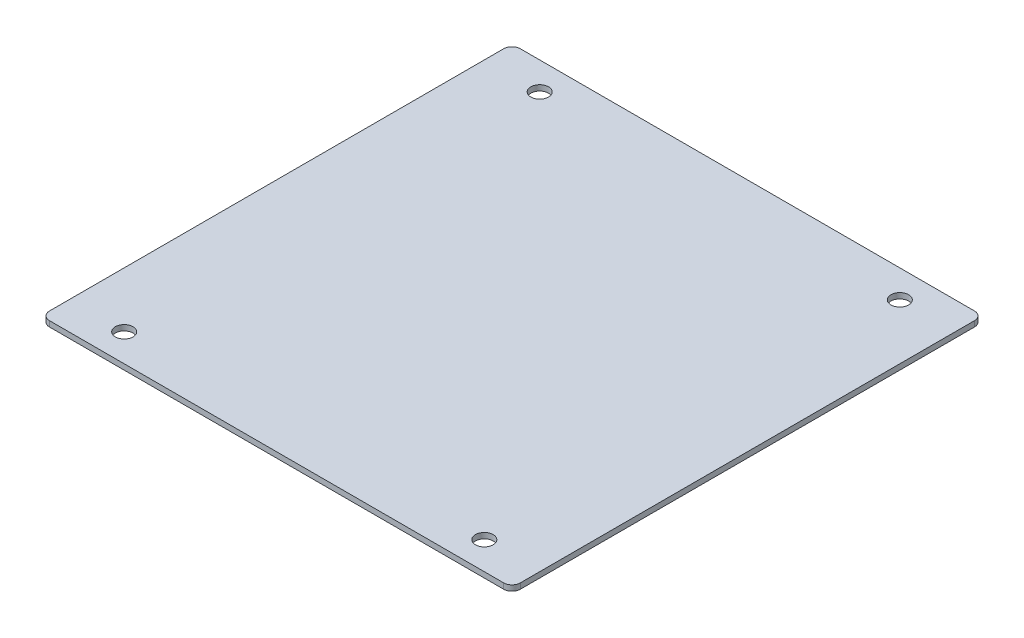
ISO-10303-21;
HEADER;
FILE_DESCRIPTION(('STEP AP214'),'2;1');
FILE_NAME('part.step','',(''),(''),'','','');
FILE_SCHEMA(('AUTOMOTIVE_DESIGN { 1 0 10303 214 1 1 1 1 }'));
ENDSEC;
DATA;
#1=APPLICATION_CONTEXT('core data for automotive mechanical design processes');
#2=APPLICATION_PROTOCOL_DEFINITION('international standard','automotive_design',2000,#1);
#3=PRODUCT_CONTEXT('',#1,'mechanical');
#4=PRODUCT('Part','Part','',(#3));
#5=PRODUCT_RELATED_PRODUCT_CATEGORY('part','',(#4));
#6=PRODUCT_DEFINITION_FORMATION('','',#4);
#7=PRODUCT_DEFINITION_CONTEXT('part definition',#1,'design');
#8=PRODUCT_DEFINITION('design','',#6,#7);
#9=PRODUCT_DEFINITION_SHAPE('','',#8);
#10=(LENGTH_UNIT() NAMED_UNIT(*) SI_UNIT(.MILLI.,.METRE.));
#11=(NAMED_UNIT(*) PLANE_ANGLE_UNIT() SI_UNIT($,.RADIAN.));
#12=(NAMED_UNIT(*) SI_UNIT($,.STERADIAN.) SOLID_ANGLE_UNIT());
#13=UNCERTAINTY_MEASURE_WITH_UNIT(LENGTH_MEASURE(1.E-05),#10,'distance_accuracy_value','');
#14=(GEOMETRIC_REPRESENTATION_CONTEXT(3) GLOBAL_UNCERTAINTY_ASSIGNED_CONTEXT((#13)) GLOBAL_UNIT_ASSIGNED_CONTEXT((#10,
#11,#12)) REPRESENTATION_CONTEXT('',''));
#15=CARTESIAN_POINT('',(0.,0.,0.));
#16=DIRECTION('',(0.,0.,1.));
#17=DIRECTION('',(1.,0.,0.));
#18=AXIS2_PLACEMENT_3D('',#15,#16,#17);
#19=CARTESIAN_POINT('',(85.,2.,85.));
#20=DIRECTION('',(-1.,0.,0.));
#21=DIRECTION('',(0.,0.,1.));
#22=AXIS2_PLACEMENT_3D('',#19,#20,#21);
#23=PLANE('',#22);
#24=DIRECTION('',(0.,0.,-1.));
#25=VECTOR('',#24,1.);
#26=CARTESIAN_POINT('',(85.,0.,85.));
#27=LINE('',#26,#25);
#28=CARTESIAN_POINT('',(85.,0.,82.));
#29=VERTEX_POINT('',#28);
#30=CARTESIAN_POINT('',(85.,0.,-82.));
#31=VERTEX_POINT('',#30);
#32=EDGE_CURVE('E129',#29,#31,#27,.T.);
#33=ORIENTED_EDGE('',*,*,#32,.T.);
#34=DIRECTION('',(0.,-1.,0.));
#35=VECTOR('',#34,1.);
#36=CARTESIAN_POINT('',(85.,2.,-82.));
#37=LINE('',#36,#35);
#38=CARTESIAN_POINT('',(85.,2.,-82.));
#39=VERTEX_POINT('',#38);
#40=EDGE_CURVE('E152',#31,#39,#37,.F.);
#41=ORIENTED_EDGE('',*,*,#40,.T.);
#42=DIRECTION('',(0.,0.,-1.));
#43=VECTOR('',#42,1.);
#44=CARTESIAN_POINT('',(85.,2.,85.));
#45=LINE('',#44,#43);
#46=CARTESIAN_POINT('',(85.,2.,82.));
#47=VERTEX_POINT('',#46);
#48=EDGE_CURVE('E127',#47,#39,#45,.T.);
#49=ORIENTED_EDGE('',*,*,#48,.F.);
#50=DIRECTION('',(0.,-1.,0.));
#51=VECTOR('',#50,1.);
#52=CARTESIAN_POINT('',(85.,2.,82.));
#53=LINE('',#52,#51);
#54=EDGE_CURVE('E149',#47,#29,#53,.T.);
#55=ORIENTED_EDGE('',*,*,#54,.T.);
#56=EDGE_LOOP('',(#33,#41,#49,#55));
#57=FACE_BOUND('',#56,.T.);
#58=ADVANCED_FACE('F34',(#57),#23,.F.);
#59=CARTESIAN_POINT('',(-85.,2.,-85.));
#60=DIRECTION('',(0.,0.,1.));
#61=DIRECTION('',(1.,0.,0.));
#62=AXIS2_PLACEMENT_3D('',#59,#60,#61);
#63=PLANE('',#62);
#64=DIRECTION('',(-1.,0.,0.));
#65=VECTOR('',#64,1.);
#66=CARTESIAN_POINT('',(-85.,0.,-85.));
#67=LINE('',#66,#65);
#68=CARTESIAN_POINT('',(82.,0.,-85.));
#69=VERTEX_POINT('',#68);
#70=CARTESIAN_POINT('',(-82.,0.,-85.));
#71=VERTEX_POINT('',#70);
#72=EDGE_CURVE('E125',#69,#71,#67,.T.);
#73=ORIENTED_EDGE('',*,*,#72,.T.);
#74=DIRECTION('',(0.,-1.,0.));
#75=VECTOR('',#74,1.);
#76=CARTESIAN_POINT('',(-82.,2.,-85.));
#77=LINE('',#76,#75);
#78=CARTESIAN_POINT('',(-82.,2.,-85.));
#79=VERTEX_POINT('',#78);
#80=EDGE_CURVE('E104',#71,#79,#77,.F.);
#81=ORIENTED_EDGE('',*,*,#80,.T.);
#82=DIRECTION('',(-1.,0.,0.));
#83=VECTOR('',#82,1.);
#84=CARTESIAN_POINT('',(-85.,2.,-85.));
#85=LINE('',#84,#83);
#86=CARTESIAN_POINT('',(82.,2.,-85.));
#87=VERTEX_POINT('',#86);
#88=EDGE_CURVE('E168',#87,#79,#85,.T.);
#89=ORIENTED_EDGE('',*,*,#88,.F.);
#90=DIRECTION('',(0.,-1.,0.));
#91=VECTOR('',#90,1.);
#92=CARTESIAN_POINT('',(82.,2.,-85.));
#93=LINE('',#92,#91);
#94=EDGE_CURVE('E109',#87,#69,#93,.T.);
#95=ORIENTED_EDGE('',*,*,#94,.T.);
#96=EDGE_LOOP('',(#73,#81,#89,#95));
#97=FACE_BOUND('',#96,.T.);
#98=ADVANCED_FACE('F217',(#97),#63,.F.);
#99=CARTESIAN_POINT('',(-85.,2.,85.));
#100=DIRECTION('',(1.,0.,0.));
#101=DIRECTION('',(0.,0.,-1.));
#102=AXIS2_PLACEMENT_3D('',#99,#100,#101);
#103=PLANE('',#102);
#104=DIRECTION('',(0.,0.,1.));
#105=VECTOR('',#104,1.);
#106=CARTESIAN_POINT('',(-85.,2.,85.));
#107=LINE('',#106,#105);
#108=CARTESIAN_POINT('',(-85.,2.,-82.));
#109=VERTEX_POINT('',#108);
#110=CARTESIAN_POINT('',(-85.,2.,82.));
#111=VERTEX_POINT('',#110);
#112=EDGE_CURVE('E118',#109,#111,#107,.T.);
#113=ORIENTED_EDGE('',*,*,#112,.F.);
#114=DIRECTION('',(0.,-1.,0.));
#115=VECTOR('',#114,1.);
#116=CARTESIAN_POINT('',(-85.,2.,-82.));
#117=LINE('',#116,#115);
#118=CARTESIAN_POINT('',(-85.,0.,-82.));
#119=VERTEX_POINT('',#118);
#120=EDGE_CURVE('E103',#109,#119,#117,.T.);
#121=ORIENTED_EDGE('',*,*,#120,.T.);
#122=DIRECTION('',(0.,0.,1.));
#123=VECTOR('',#122,1.);
#124=CARTESIAN_POINT('',(-85.,0.,85.));
#125=LINE('',#124,#123);
#126=CARTESIAN_POINT('',(-85.,0.,82.));
#127=VERTEX_POINT('',#126);
#128=EDGE_CURVE('E116',#119,#127,#125,.T.);
#129=ORIENTED_EDGE('',*,*,#128,.T.);
#130=DIRECTION('',(0.,-1.,0.));
#131=VECTOR('',#130,1.);
#132=CARTESIAN_POINT('',(-85.,2.,82.));
#133=LINE('',#132,#131);
#134=EDGE_CURVE('E120',#127,#111,#133,.F.);
#135=ORIENTED_EDGE('',*,*,#134,.T.);
#136=EDGE_LOOP('',(#113,#121,#129,#135));
#137=FACE_BOUND('',#136,.T.);
#138=ADVANCED_FACE('F115',(#137),#103,.F.);
#139=CARTESIAN_POINT('',(-85.,2.,85.));
#140=DIRECTION('',(0.,0.,-1.));
#141=DIRECTION('',(-1.,0.,0.));
#142=AXIS2_PLACEMENT_3D('',#139,#140,#141);
#143=PLANE('',#142);
#144=DIRECTION('',(1.,0.,0.));
#145=VECTOR('',#144,1.);
#146=CARTESIAN_POINT('',(-85.,0.,85.));
#147=LINE('',#146,#145);
#148=CARTESIAN_POINT('',(-82.,0.,85.));
#149=VERTEX_POINT('',#148);
#150=CARTESIAN_POINT('',(82.,0.,85.));
#151=VERTEX_POINT('',#150);
#152=EDGE_CURVE('E124',#149,#151,#147,.T.);
#153=ORIENTED_EDGE('',*,*,#152,.T.);
#154=DIRECTION('',(0.,-1.,0.));
#155=VECTOR('',#154,1.);
#156=CARTESIAN_POINT('',(82.,2.,85.));
#157=LINE('',#156,#155);
#158=CARTESIAN_POINT('',(82.,2.,85.));
#159=VERTEX_POINT('',#158);
#160=EDGE_CURVE('E11',#151,#159,#157,.F.);
#161=ORIENTED_EDGE('',*,*,#160,.T.);
#162=DIRECTION('',(1.,0.,0.));
#163=VECTOR('',#162,1.);
#164=CARTESIAN_POINT('',(-85.,2.,85.));
#165=LINE('',#164,#163);
#166=CARTESIAN_POINT('',(-82.,2.,85.));
#167=VERTEX_POINT('',#166);
#168=EDGE_CURVE('E133',#167,#159,#165,.T.);
#169=ORIENTED_EDGE('',*,*,#168,.F.);
#170=DIRECTION('',(0.,-1.,0.));
#171=VECTOR('',#170,1.);
#172=CARTESIAN_POINT('',(-82.,2.,85.));
#173=LINE('',#172,#171);
#174=EDGE_CURVE('E42',#167,#149,#173,.T.);
#175=ORIENTED_EDGE('',*,*,#174,.T.);
#176=EDGE_LOOP('',(#153,#161,#169,#175));
#177=FACE_BOUND('',#176,.T.);
#178=ADVANCED_FACE('F155',(#177),#143,.F.);
#179=CARTESIAN_POINT('',(0.,2.,0.));
#180=DIRECTION('',(0.,-1.,0.));
#181=DIRECTION('',(0.,0.,-1.));
#182=AXIS2_PLACEMENT_3D('',#179,#180,#181);
#183=PLANE('',#182);
#184=CARTESIAN_POINT('',(-65.,2.,-75.));
#185=DIRECTION('',(0.,1.,0.));
#186=DIRECTION('',(0.,0.,1.));
#187=AXIS2_PLACEMENT_3D('',#184,#185,#186);
#188=CIRCLE('',#187,3.2);
#189=CARTESIAN_POINT('',(-65.,2.,-71.8));
#190=VERTEX_POINT('',#189);
#191=EDGE_CURVE('E200',#190,#190,#188,.T.);
#192=ORIENTED_EDGE('',*,*,#191,.F.);
#193=EDGE_LOOP('',(#192));
#194=FACE_BOUND('',#193,.T.);
#195=CARTESIAN_POINT('',(65.,2.,75.));
#196=DIRECTION('',(0.,1.,0.));
#197=DIRECTION('',(0.,0.,1.));
#198=AXIS2_PLACEMENT_3D('',#195,#196,#197);
#199=CIRCLE('',#198,3.19999999999999);
#200=CARTESIAN_POINT('',(65.,2.,78.2));
#201=VERTEX_POINT('',#200);
#202=EDGE_CURVE('E194',#201,#201,#199,.T.);
#203=ORIENTED_EDGE('',*,*,#202,.F.);
#204=EDGE_LOOP('',(#203));
#205=FACE_BOUND('',#204,.T.);
#206=CARTESIAN_POINT('',(-65.,2.,75.));
#207=DIRECTION('',(0.,1.,0.));
#208=DIRECTION('',(0.,0.,1.));
#209=AXIS2_PLACEMENT_3D('',#206,#207,#208);
#210=CIRCLE('',#209,3.2);
#211=CARTESIAN_POINT('',(-65.,2.,78.2));
#212=VERTEX_POINT('',#211);
#213=EDGE_CURVE('E186',#212,#212,#210,.T.);
#214=ORIENTED_EDGE('',*,*,#213,.F.);
#215=EDGE_LOOP('',(#214));
#216=FACE_BOUND('',#215,.T.);
#217=CARTESIAN_POINT('',(65.,2.,-75.));
#218=DIRECTION('',(0.,1.,0.));
#219=DIRECTION('',(0.,0.,1.));
#220=AXIS2_PLACEMENT_3D('',#217,#218,#219);
#221=CIRCLE('',#220,3.19999999999999);
#222=CARTESIAN_POINT('',(65.,2.,-71.8));
#223=VERTEX_POINT('',#222);
#224=EDGE_CURVE('E178',#223,#223,#221,.T.);
#225=ORIENTED_EDGE('',*,*,#224,.F.);
#226=EDGE_LOOP('',(#225));
#227=FACE_BOUND('',#226,.T.);
#228=ORIENTED_EDGE('',*,*,#88,.T.);
#229=CARTESIAN_POINT('',(-82.,2.,-82.));
#230=DIRECTION('',(0.,-1.,0.));
#231=DIRECTION('',(0.,0.,-1.));
#232=AXIS2_PLACEMENT_3D('',#229,#230,#231);
#233=CIRCLE('',#232,3.);
#234=EDGE_CURVE('E147',#79,#109,#233,.F.);
#235=ORIENTED_EDGE('',*,*,#234,.T.);
#236=ORIENTED_EDGE('',*,*,#112,.T.);
#237=CARTESIAN_POINT('',(-82.,2.,82.));
#238=DIRECTION('',(0.,-1.,0.));
#239=DIRECTION('',(0.,0.,-1.));
#240=AXIS2_PLACEMENT_3D('',#237,#238,#239);
#241=CIRCLE('',#240,3.);
#242=EDGE_CURVE('E54',#111,#167,#241,.F.);
#243=ORIENTED_EDGE('',*,*,#242,.T.);
#244=ORIENTED_EDGE('',*,*,#168,.T.);
#245=CARTESIAN_POINT('',(82.,2.,82.));
#246=DIRECTION('',(0.,-1.,0.));
#247=DIRECTION('',(0.,0.,-1.));
#248=AXIS2_PLACEMENT_3D('',#245,#246,#247);
#249=CIRCLE('',#248,3.);
#250=EDGE_CURVE('E143',#159,#47,#249,.F.);
#251=ORIENTED_EDGE('',*,*,#250,.T.);
#252=ORIENTED_EDGE('',*,*,#48,.T.);
#253=CARTESIAN_POINT('',(82.,2.,-82.));
#254=DIRECTION('',(0.,-1.,0.));
#255=DIRECTION('',(0.,0.,-1.));
#256=AXIS2_PLACEMENT_3D('',#253,#254,#255);
#257=CIRCLE('',#256,3.);
#258=EDGE_CURVE('E145',#39,#87,#257,.F.);
#259=ORIENTED_EDGE('',*,*,#258,.T.);
#260=EDGE_LOOP('',(#228,#235,#236,#243,#244,#251,#252,#259));
#261=FACE_BOUND('',#260,.T.);
#262=ADVANCED_FACE('F206',(#194,#205,#216,#227,#261),#183,.F.);
#263=CARTESIAN_POINT('',(0.,0.,0.));
#264=DIRECTION('',(0.,-1.,0.));
#265=DIRECTION('',(0.,0.,-1.));
#266=AXIS2_PLACEMENT_3D('',#263,#264,#265);
#267=PLANE('',#266);
#268=CARTESIAN_POINT('',(-65.,0.,-75.));
#269=DIRECTION('',(0.,1.,0.));
#270=DIRECTION('',(0.,0.,1.));
#271=AXIS2_PLACEMENT_3D('',#268,#269,#270);
#272=CIRCLE('',#271,3.2);
#273=CARTESIAN_POINT('',(-65.,0.,-71.8));
#274=VERTEX_POINT('',#273);
#275=EDGE_CURVE('E197',#274,#274,#272,.T.);
#276=ORIENTED_EDGE('',*,*,#275,.T.);
#277=EDGE_LOOP('',(#276));
#278=FACE_BOUND('',#277,.T.);
#279=CARTESIAN_POINT('',(65.,0.,75.));
#280=DIRECTION('',(0.,1.,0.));
#281=DIRECTION('',(0.,0.,1.));
#282=AXIS2_PLACEMENT_3D('',#279,#280,#281);
#283=CIRCLE('',#282,3.19999999999999);
#284=CARTESIAN_POINT('',(65.,0.,78.2));
#285=VERTEX_POINT('',#284);
#286=EDGE_CURVE('E191',#285,#285,#283,.T.);
#287=ORIENTED_EDGE('',*,*,#286,.T.);
#288=EDGE_LOOP('',(#287));
#289=FACE_BOUND('',#288,.T.);
#290=CARTESIAN_POINT('',(-65.,0.,75.));
#291=DIRECTION('',(0.,1.,0.));
#292=DIRECTION('',(0.,0.,1.));
#293=AXIS2_PLACEMENT_3D('',#290,#291,#292);
#294=CIRCLE('',#293,3.2);
#295=CARTESIAN_POINT('',(-65.,0.,78.2));
#296=VERTEX_POINT('',#295);
#297=EDGE_CURVE('E182',#296,#296,#294,.T.);
#298=ORIENTED_EDGE('',*,*,#297,.T.);
#299=EDGE_LOOP('',(#298));
#300=FACE_BOUND('',#299,.T.);
#301=CARTESIAN_POINT('',(65.,0.,-75.));
#302=DIRECTION('',(0.,1.,0.));
#303=DIRECTION('',(0.,0.,1.));
#304=AXIS2_PLACEMENT_3D('',#301,#302,#303);
#305=CIRCLE('',#304,3.19999999999999);
#306=CARTESIAN_POINT('',(65.,0.,-71.8));
#307=VERTEX_POINT('',#306);
#308=EDGE_CURVE('E173',#307,#307,#305,.T.);
#309=ORIENTED_EDGE('',*,*,#308,.T.);
#310=EDGE_LOOP('',(#309));
#311=FACE_BOUND('',#310,.T.);
#312=ORIENTED_EDGE('',*,*,#128,.F.);
#313=CARTESIAN_POINT('',(-82.,0.,-82.));
#314=DIRECTION('',(0.,-1.,0.));
#315=DIRECTION('',(0.,0.,-1.));
#316=AXIS2_PLACEMENT_3D('',#313,#314,#315);
#317=CIRCLE('',#316,3.);
#318=EDGE_CURVE('E99',#119,#71,#317,.T.);
#319=ORIENTED_EDGE('',*,*,#318,.T.);
#320=ORIENTED_EDGE('',*,*,#72,.F.);
#321=CARTESIAN_POINT('',(82.,0.,-82.));
#322=DIRECTION('',(0.,-1.,0.));
#323=DIRECTION('',(0.,0.,-1.));
#324=AXIS2_PLACEMENT_3D('',#321,#322,#323);
#325=CIRCLE('',#324,3.);
#326=EDGE_CURVE('E110',#69,#31,#325,.T.);
#327=ORIENTED_EDGE('',*,*,#326,.T.);
#328=ORIENTED_EDGE('',*,*,#32,.F.);
#329=CARTESIAN_POINT('',(82.,0.,82.));
#330=DIRECTION('',(0.,-1.,0.));
#331=DIRECTION('',(0.,0.,-1.));
#332=AXIS2_PLACEMENT_3D('',#329,#330,#331);
#333=CIRCLE('',#332,3.);
#334=EDGE_CURVE('E136',#29,#151,#333,.T.);
#335=ORIENTED_EDGE('',*,*,#334,.T.);
#336=ORIENTED_EDGE('',*,*,#152,.F.);
#337=CARTESIAN_POINT('',(-82.,0.,82.));
#338=DIRECTION('',(0.,-1.,0.));
#339=DIRECTION('',(0.,0.,-1.));
#340=AXIS2_PLACEMENT_3D('',#337,#338,#339);
#341=CIRCLE('',#340,3.);
#342=EDGE_CURVE('E119',#149,#127,#341,.T.);
#343=ORIENTED_EDGE('',*,*,#342,.T.);
#344=EDGE_LOOP('',(#312,#319,#320,#327,#328,#335,#336,#343));
#345=FACE_BOUND('',#344,.T.);
#346=ADVANCED_FACE('F122',(#278,#289,#300,#311,#345),#267,.T.);
#347=CARTESIAN_POINT('',(-82.,2.,-82.));
#348=DIRECTION('',(0.,-1.,0.));
#349=DIRECTION('',(0.,0.,-1.));
#350=AXIS2_PLACEMENT_3D('',#347,#348,#349);
#351=CYLINDRICAL_SURFACE('',#350,3.);
#352=ORIENTED_EDGE('',*,*,#234,.F.);
#353=ORIENTED_EDGE('',*,*,#80,.F.);
#354=ORIENTED_EDGE('',*,*,#318,.F.);
#355=ORIENTED_EDGE('',*,*,#120,.F.);
#356=EDGE_LOOP('',(#352,#353,#354,#355));
#357=FACE_BOUND('',#356,.T.);
#358=ADVANCED_FACE('F102',(#357),#351,.T.);
#359=CARTESIAN_POINT('',(82.,2.,-82.));
#360=DIRECTION('',(0.,-1.,0.));
#361=DIRECTION('',(0.,0.,-1.));
#362=AXIS2_PLACEMENT_3D('',#359,#360,#361);
#363=CYLINDRICAL_SURFACE('',#362,3.);
#364=ORIENTED_EDGE('',*,*,#258,.F.);
#365=ORIENTED_EDGE('',*,*,#40,.F.);
#366=ORIENTED_EDGE('',*,*,#326,.F.);
#367=ORIENTED_EDGE('',*,*,#94,.F.);
#368=EDGE_LOOP('',(#364,#365,#366,#367));
#369=FACE_BOUND('',#368,.T.);
#370=ADVANCED_FACE('F219',(#369),#363,.T.);
#371=CARTESIAN_POINT('',(82.,2.,82.));
#372=DIRECTION('',(0.,-1.,0.));
#373=DIRECTION('',(0.,0.,-1.));
#374=AXIS2_PLACEMENT_3D('',#371,#372,#373);
#375=CYLINDRICAL_SURFACE('',#374,3.);
#376=ORIENTED_EDGE('',*,*,#250,.F.);
#377=ORIENTED_EDGE('',*,*,#160,.F.);
#378=ORIENTED_EDGE('',*,*,#334,.F.);
#379=ORIENTED_EDGE('',*,*,#54,.F.);
#380=EDGE_LOOP('',(#376,#377,#378,#379));
#381=FACE_BOUND('',#380,.T.);
#382=ADVANCED_FACE('F162',(#381),#375,.T.);
#383=CARTESIAN_POINT('',(-82.,2.,82.));
#384=DIRECTION('',(0.,-1.,0.));
#385=DIRECTION('',(0.,0.,-1.));
#386=AXIS2_PLACEMENT_3D('',#383,#384,#385);
#387=CYLINDRICAL_SURFACE('',#386,3.);
#388=ORIENTED_EDGE('',*,*,#242,.F.);
#389=ORIENTED_EDGE('',*,*,#134,.F.);
#390=ORIENTED_EDGE('',*,*,#342,.F.);
#391=ORIENTED_EDGE('',*,*,#174,.F.);
#392=EDGE_LOOP('',(#388,#389,#390,#391));
#393=FACE_BOUND('',#392,.T.);
#394=ADVANCED_FACE('F36',(#393),#387,.T.);
#395=CARTESIAN_POINT('',(65.,2.,-75.));
#396=DIRECTION('',(0.,1.,0.));
#397=DIRECTION('',(0.,0.,1.));
#398=AXIS2_PLACEMENT_3D('',#395,#396,#397);
#399=CYLINDRICAL_SURFACE('',#398,3.19999999999999);
#400=ORIENTED_EDGE('',*,*,#308,.F.);
#401=EDGE_LOOP('',(#400));
#402=FACE_BOUND('',#401,.T.);
#403=ORIENTED_EDGE('',*,*,#224,.T.);
#404=EDGE_LOOP('',(#403));
#405=FACE_BOUND('',#404,.T.);
#406=ADVANCED_FACE('F241',(#402,#405),#399,.F.);
#407=CARTESIAN_POINT('',(-65.,2.,75.));
#408=DIRECTION('',(0.,1.,0.));
#409=DIRECTION('',(0.,0.,1.));
#410=AXIS2_PLACEMENT_3D('',#407,#408,#409);
#411=CYLINDRICAL_SURFACE('',#410,3.2);
#412=ORIENTED_EDGE('',*,*,#297,.F.);
#413=EDGE_LOOP('',(#412));
#414=FACE_BOUND('',#413,.T.);
#415=ORIENTED_EDGE('',*,*,#213,.T.);
#416=EDGE_LOOP('',(#415));
#417=FACE_BOUND('',#416,.T.);
#418=ADVANCED_FACE('F244',(#414,#417),#411,.F.);
#419=CARTESIAN_POINT('',(65.,2.,75.));
#420=DIRECTION('',(0.,1.,0.));
#421=DIRECTION('',(0.,0.,1.));
#422=AXIS2_PLACEMENT_3D('',#419,#420,#421);
#423=CYLINDRICAL_SURFACE('',#422,3.19999999999999);
#424=ORIENTED_EDGE('',*,*,#286,.F.);
#425=EDGE_LOOP('',(#424));
#426=FACE_BOUND('',#425,.T.);
#427=ORIENTED_EDGE('',*,*,#202,.T.);
#428=EDGE_LOOP('',(#427));
#429=FACE_BOUND('',#428,.T.);
#430=ADVANCED_FACE('F248',(#426,#429),#423,.F.);
#431=CARTESIAN_POINT('',(-65.,2.,-75.));
#432=DIRECTION('',(0.,1.,0.));
#433=DIRECTION('',(0.,0.,1.));
#434=AXIS2_PLACEMENT_3D('',#431,#432,#433);
#435=CYLINDRICAL_SURFACE('',#434,3.2);
#436=ORIENTED_EDGE('',*,*,#275,.F.);
#437=EDGE_LOOP('',(#436));
#438=FACE_BOUND('',#437,.T.);
#439=ORIENTED_EDGE('',*,*,#191,.T.);
#440=EDGE_LOOP('',(#439));
#441=FACE_BOUND('',#440,.T.);
#442=ADVANCED_FACE('F204',(#438,#441),#435,.F.);
#443=CLOSED_SHELL('',(#58,#98,#138,#178,#262,#346,#358,#370,#382,#394,#406,#418,#430,#442));
#444=MANIFOLD_SOLID_BREP('B2',#443);
#445=ADVANCED_BREP_SHAPE_REPRESENTATION('',(#18,#444),#14);
#446=SHAPE_DEFINITION_REPRESENTATION(#9,#445);
ENDSEC;
END-ISO-10303-21;
